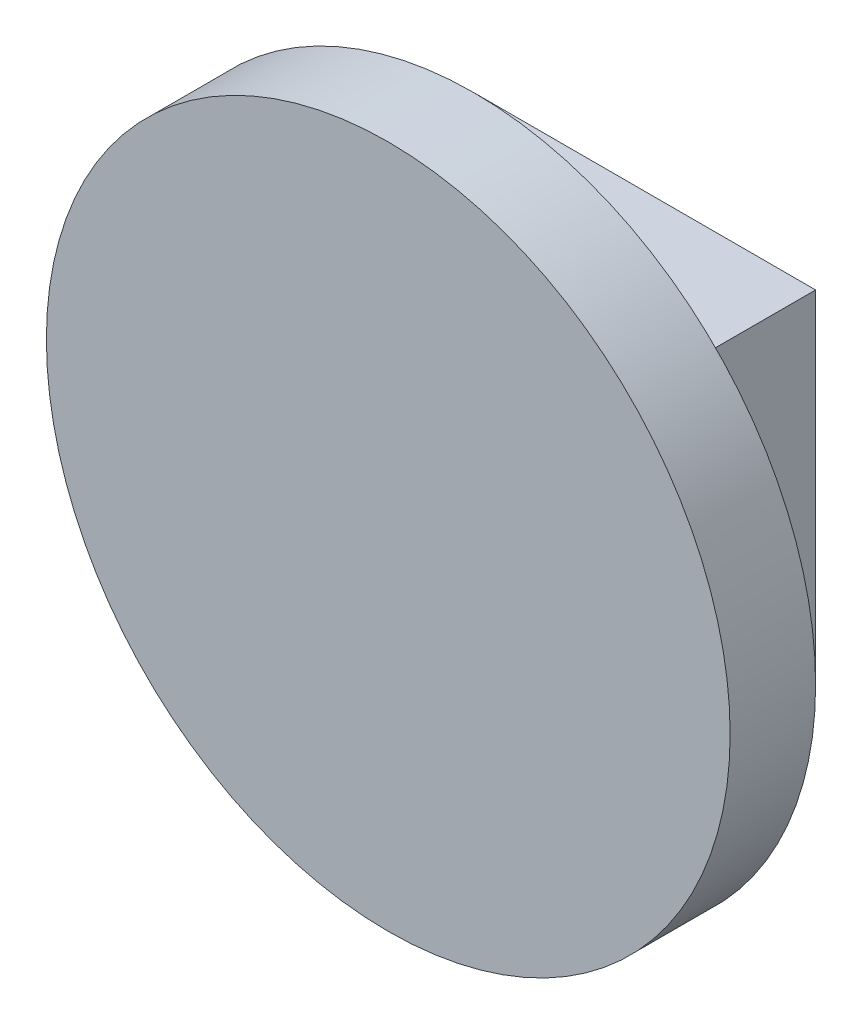
ISO-10303-21;
HEADER;
FILE_DESCRIPTION(('STEP AP214'),'2;1');
FILE_NAME('part.step','',(''),(''),'','','');
FILE_SCHEMA(('AUTOMOTIVE_DESIGN { 1 0 10303 214 1 1 1 1 }'));
ENDSEC;
DATA;
#1=APPLICATION_CONTEXT('core data for automotive mechanical design processes');
#2=APPLICATION_PROTOCOL_DEFINITION('international standard','automotive_design',2000,#1);
#3=PRODUCT_CONTEXT('',#1,'mechanical');
#4=PRODUCT('Part','Part','',(#3));
#5=PRODUCT_RELATED_PRODUCT_CATEGORY('part','',(#4));
#6=PRODUCT_DEFINITION_FORMATION('','',#4);
#7=PRODUCT_DEFINITION_CONTEXT('part definition',#1,'design');
#8=PRODUCT_DEFINITION('design','',#6,#7);
#9=PRODUCT_DEFINITION_SHAPE('','',#8);
#10=(LENGTH_UNIT() NAMED_UNIT(*) SI_UNIT(.MILLI.,.METRE.));
#11=(NAMED_UNIT(*) PLANE_ANGLE_UNIT() SI_UNIT($,.RADIAN.));
#12=(NAMED_UNIT(*) SI_UNIT($,.STERADIAN.) SOLID_ANGLE_UNIT());
#13=UNCERTAINTY_MEASURE_WITH_UNIT(LENGTH_MEASURE(1.E-05),#10,'distance_accuracy_value','');
#14=(GEOMETRIC_REPRESENTATION_CONTEXT(3) GLOBAL_UNCERTAINTY_ASSIGNED_CONTEXT((#13)) GLOBAL_UNIT_ASSIGNED_CONTEXT((#10,
#11,#12)) REPRESENTATION_CONTEXT('',''));
#15=CARTESIAN_POINT('',(0.,0.,0.));
#16=DIRECTION('',(0.,0.,1.));
#17=DIRECTION('',(1.,0.,0.));
#18=AXIS2_PLACEMENT_3D('',#15,#16,#17);
#19=CARTESIAN_POINT('',(0.,0.,0.));
#20=DIRECTION('',(0.,0.,1.));
#21=DIRECTION('',(1.,0.,0.));
#22=AXIS2_PLACEMENT_3D('',#19,#20,#21);
#23=PLANE('',#22);
#24=CARTESIAN_POINT('',(0.,0.,0.));
#25=DIRECTION('',(0.,0.,1.));
#26=DIRECTION('',(1.,0.,0.));
#27=AXIS2_PLACEMENT_3D('',#24,#25,#26);
#28=CIRCLE('',#27,6.35);
#29=CARTESIAN_POINT('',(6.35,0.,0.));
#30=VERTEX_POINT('',#29);
#31=EDGE_CURVE('E39',#30,#30,#28,.T.);
#32=ORIENTED_EDGE('',*,*,#31,.F.);
#33=EDGE_LOOP('',(#32));
#34=FACE_BOUND('',#33,.T.);
#35=DIRECTION('',(0.,1.,0.));
#36=VECTOR('',#35,1.);
#37=CARTESIAN_POINT('',(-3.175,-3.175,0.));
#38=LINE('',#37,#36);
#39=CARTESIAN_POINT('',(-3.175,-3.175,0.));
#40=VERTEX_POINT('',#39);
#41=CARTESIAN_POINT('',(-3.175,3.175,0.));
#42=VERTEX_POINT('',#41);
#43=EDGE_CURVE('E117',#40,#42,#38,.T.);
#44=ORIENTED_EDGE('',*,*,#43,.F.);
#45=DIRECTION('',(-1.,0.,0.));
#46=VECTOR('',#45,1.);
#47=CARTESIAN_POINT('',(3.175,-3.175,0.));
#48=LINE('',#47,#46);
#49=CARTESIAN_POINT('',(3.175,-3.175,0.));
#50=VERTEX_POINT('',#49);
#51=EDGE_CURVE('E145',#50,#40,#48,.T.);
#52=ORIENTED_EDGE('',*,*,#51,.F.);
#53=DIRECTION('',(0.,-1.,0.));
#54=VECTOR('',#53,1.);
#55=CARTESIAN_POINT('',(3.175,-3.175,0.));
#56=LINE('',#55,#54);
#57=CARTESIAN_POINT('',(3.175,3.175,0.));
#58=VERTEX_POINT('',#57);
#59=EDGE_CURVE('E55',#58,#50,#56,.T.);
#60=ORIENTED_EDGE('',*,*,#59,.F.);
#61=DIRECTION('',(1.,0.,0.));
#62=VECTOR('',#61,1.);
#63=CARTESIAN_POINT('',(3.175,3.175,0.));
#64=LINE('',#63,#62);
#65=EDGE_CURVE('E50',#42,#58,#64,.T.);
#66=ORIENTED_EDGE('',*,*,#65,.F.);
#67=EDGE_LOOP('',(#44,#52,#60,#66));
#68=FACE_BOUND('',#67,.T.);
#69=ADVANCED_FACE('F35',(#34,#68),#23,.F.);
#70=CARTESIAN_POINT('',(0.,0.,1.5875));
#71=DIRECTION('',(0.,0.,-1.));
#72=DIRECTION('',(-1.,0.,0.));
#73=AXIS2_PLACEMENT_3D('',#70,#71,#72);
#74=CYLINDRICAL_SURFACE('',#73,6.35);
#75=CARTESIAN_POINT('',(0.,0.,1.5875));
#76=DIRECTION('',(0.,0.,1.));
#77=DIRECTION('',(1.,0.,0.));
#78=AXIS2_PLACEMENT_3D('',#75,#76,#77);
#79=CIRCLE('',#78,6.35);
#80=CARTESIAN_POINT('',(6.35,0.,1.5875));
#81=VERTEX_POINT('',#80);
#82=EDGE_CURVE('E11',#81,#81,#79,.T.);
#83=ORIENTED_EDGE('',*,*,#82,.F.);
#84=EDGE_LOOP('',(#83));
#85=FACE_BOUND('',#84,.T.);
#86=ORIENTED_EDGE('',*,*,#31,.T.);
#87=EDGE_LOOP('',(#86));
#88=FACE_BOUND('',#87,.T.);
#89=ADVANCED_FACE('F37',(#85,#88),#74,.T.);
#90=CARTESIAN_POINT('',(0.,0.,1.5875));
#91=DIRECTION('',(0.,0.,1.));
#92=DIRECTION('',(1.,0.,0.));
#93=AXIS2_PLACEMENT_3D('',#90,#91,#92);
#94=PLANE('',#93);
#95=ORIENTED_EDGE('',*,*,#82,.T.);
#96=EDGE_LOOP('',(#95));
#97=FACE_BOUND('',#96,.T.);
#98=ADVANCED_FACE('F199',(#97),#94,.T.);
#99=CARTESIAN_POINT('',(0.,0.,-3.175));
#100=DIRECTION('',(0.,0.,1.));
#101=DIRECTION('',(1.,0.,0.));
#102=AXIS2_PLACEMENT_3D('',#99,#100,#101);
#103=PLANE('',#102);
#104=DIRECTION('',(0.,1.,0.));
#105=VECTOR('',#104,1.);
#106=CARTESIAN_POINT('',(-3.175,-3.175,-3.175));
#107=LINE('',#106,#105);
#108=CARTESIAN_POINT('',(-3.175,-3.175,-3.175));
#109=VERTEX_POINT('',#108);
#110=CARTESIAN_POINT('',(-3.175,3.175,-3.175));
#111=VERTEX_POINT('',#110);
#112=EDGE_CURVE('E141',#109,#111,#107,.T.);
#113=ORIENTED_EDGE('',*,*,#112,.T.);
#114=DIRECTION('',(1.,0.,0.));
#115=VECTOR('',#114,1.);
#116=CARTESIAN_POINT('',(3.175,3.175,-3.175));
#117=LINE('',#116,#115);
#118=CARTESIAN_POINT('',(3.175,3.175,-3.175));
#119=VERTEX_POINT('',#118);
#120=EDGE_CURVE('E144',#111,#119,#117,.T.);
#121=ORIENTED_EDGE('',*,*,#120,.T.);
#122=DIRECTION('',(0.,-1.,0.));
#123=VECTOR('',#122,1.);
#124=CARTESIAN_POINT('',(3.175,-3.175,-3.175));
#125=LINE('',#124,#123);
#126=CARTESIAN_POINT('',(3.175,-3.175,-3.175));
#127=VERTEX_POINT('',#126);
#128=EDGE_CURVE('E147',#119,#127,#125,.T.);
#129=ORIENTED_EDGE('',*,*,#128,.T.);
#130=DIRECTION('',(-1.,0.,0.));
#131=VECTOR('',#130,1.);
#132=CARTESIAN_POINT('',(3.175,-3.175,-3.175));
#133=LINE('',#132,#131);
#134=EDGE_CURVE('E149',#127,#109,#133,.T.);
#135=ORIENTED_EDGE('',*,*,#134,.T.);
#136=EDGE_LOOP('',(#113,#121,#129,#135));
#137=FACE_BOUND('',#136,.T.);
#138=DIRECTION('',(0.,1.,0.));
#139=VECTOR('',#138,1.);
#140=CARTESIAN_POINT('',(-1.5875,-1.5875,-3.175));
#141=LINE('',#140,#139);
#142=CARTESIAN_POINT('',(-1.5875,-1.5875,-3.175));
#143=VERTEX_POINT('',#142);
#144=CARTESIAN_POINT('',(-1.5875,1.5875,-3.175));
#145=VERTEX_POINT('',#144);
#146=EDGE_CURVE('E99',#143,#145,#141,.T.);
#147=ORIENTED_EDGE('',*,*,#146,.F.);
#148=DIRECTION('',(-1.,0.,0.));
#149=VECTOR('',#148,1.);
#150=CARTESIAN_POINT('',(1.5875,-1.5875,-3.175));
#151=LINE('',#150,#149);
#152=CARTESIAN_POINT('',(1.5875,-1.5875,-3.175));
#153=VERTEX_POINT('',#152);
#154=EDGE_CURVE('E125',#153,#143,#151,.T.);
#155=ORIENTED_EDGE('',*,*,#154,.F.);
#156=DIRECTION('',(0.,-1.,0.));
#157=VECTOR('',#156,1.);
#158=CARTESIAN_POINT('',(1.5875,-1.5875,-3.175));
#159=LINE('',#158,#157);
#160=CARTESIAN_POINT('',(1.5875,1.5875,-3.175));
#161=VERTEX_POINT('',#160);
#162=EDGE_CURVE('E123',#161,#153,#159,.T.);
#163=ORIENTED_EDGE('',*,*,#162,.F.);
#164=DIRECTION('',(1.,0.,0.));
#165=VECTOR('',#164,1.);
#166=CARTESIAN_POINT('',(1.5875,1.5875,-3.175));
#167=LINE('',#166,#165);
#168=EDGE_CURVE('E109',#145,#161,#167,.T.);
#169=ORIENTED_EDGE('',*,*,#168,.F.);
#170=EDGE_LOOP('',(#147,#155,#163,#169));
#171=FACE_BOUND('',#170,.T.);
#172=ADVANCED_FACE('F121',(#137,#171),#103,.F.);
#173=CARTESIAN_POINT('',(-3.175,-3.175,-3.175));
#174=DIRECTION('',(1.,0.,0.));
#175=DIRECTION('',(0.,0.,-1.));
#176=AXIS2_PLACEMENT_3D('',#173,#174,#175);
#177=PLANE('',#176);
#178=ORIENTED_EDGE('',*,*,#43,.T.);
#179=DIRECTION('',(0.,0.,1.));
#180=VECTOR('',#179,1.);
#181=CARTESIAN_POINT('',(-3.175,3.175,-3.175));
#182=LINE('',#181,#180);
#183=EDGE_CURVE('E166',#111,#42,#182,.T.);
#184=ORIENTED_EDGE('',*,*,#183,.F.);
#185=ORIENTED_EDGE('',*,*,#112,.F.);
#186=DIRECTION('',(0.,0.,1.));
#187=VECTOR('',#186,1.);
#188=CARTESIAN_POINT('',(-3.175,-3.175,-3.175));
#189=LINE('',#188,#187);
#190=EDGE_CURVE('E151',#109,#40,#189,.T.);
#191=ORIENTED_EDGE('',*,*,#190,.T.);
#192=EDGE_LOOP('',(#178,#184,#185,#191));
#193=FACE_BOUND('',#192,.T.);
#194=ADVANCED_FACE('F182',(#193),#177,.F.);
#195=CARTESIAN_POINT('',(3.175,3.175,-3.175));
#196=DIRECTION('',(0.,-1.,0.));
#197=DIRECTION('',(0.,0.,-1.));
#198=AXIS2_PLACEMENT_3D('',#195,#196,#197);
#199=PLANE('',#198);
#200=ORIENTED_EDGE('',*,*,#65,.T.);
#201=DIRECTION('',(0.,0.,1.));
#202=VECTOR('',#201,1.);
#203=CARTESIAN_POINT('',(3.175,3.175,-3.175));
#204=LINE('',#203,#202);
#205=EDGE_CURVE('E163',#119,#58,#204,.T.);
#206=ORIENTED_EDGE('',*,*,#205,.F.);
#207=ORIENTED_EDGE('',*,*,#120,.F.);
#208=ORIENTED_EDGE('',*,*,#183,.T.);
#209=EDGE_LOOP('',(#200,#206,#207,#208));
#210=FACE_BOUND('',#209,.T.);
#211=ADVANCED_FACE('F188',(#210),#199,.F.);
#212=CARTESIAN_POINT('',(3.175,-3.175,-3.175));
#213=DIRECTION('',(-1.,0.,0.));
#214=DIRECTION('',(0.,0.,1.));
#215=AXIS2_PLACEMENT_3D('',#212,#213,#214);
#216=PLANE('',#215);
#217=ORIENTED_EDGE('',*,*,#59,.T.);
#218=DIRECTION('',(0.,0.,1.));
#219=VECTOR('',#218,1.);
#220=CARTESIAN_POINT('',(3.175,-3.175,-3.175));
#221=LINE('',#220,#219);
#222=EDGE_CURVE('E160',#127,#50,#221,.T.);
#223=ORIENTED_EDGE('',*,*,#222,.F.);
#224=ORIENTED_EDGE('',*,*,#128,.F.);
#225=ORIENTED_EDGE('',*,*,#205,.T.);
#226=EDGE_LOOP('',(#217,#223,#224,#225));
#227=FACE_BOUND('',#226,.T.);
#228=ADVANCED_FACE('F187',(#227),#216,.F.);
#229=CARTESIAN_POINT('',(3.175,-3.175,-3.175));
#230=DIRECTION('',(0.,1.,0.));
#231=DIRECTION('',(0.,0.,1.));
#232=AXIS2_PLACEMENT_3D('',#229,#230,#231);
#233=PLANE('',#232);
#234=ORIENTED_EDGE('',*,*,#51,.T.);
#235=ORIENTED_EDGE('',*,*,#190,.F.);
#236=ORIENTED_EDGE('',*,*,#134,.F.);
#237=ORIENTED_EDGE('',*,*,#222,.T.);
#238=EDGE_LOOP('',(#234,#235,#236,#237));
#239=FACE_BOUND('',#238,.T.);
#240=ADVANCED_FACE('F178',(#239),#233,.F.);
#241=CARTESIAN_POINT('',(-1.5875,-1.5875,-3.175));
#242=DIRECTION('',(1.,0.,0.));
#243=DIRECTION('',(0.,0.,-1.));
#244=AXIS2_PLACEMENT_3D('',#241,#242,#243);
#245=PLANE('',#244);
#246=DIRECTION('',(0.,1.,0.));
#247=VECTOR('',#246,1.);
#248=CARTESIAN_POINT('',(-1.5875,-1.5875,0.));
#249=LINE('',#248,#247);
#250=CARTESIAN_POINT('',(-1.5875,-1.5875,0.));
#251=VERTEX_POINT('',#250);
#252=CARTESIAN_POINT('',(-1.5875,1.5875,0.));
#253=VERTEX_POINT('',#252);
#254=EDGE_CURVE('E129',#251,#253,#249,.T.);
#255=ORIENTED_EDGE('',*,*,#254,.F.);
#256=DIRECTION('',(0.,0.,1.));
#257=VECTOR('',#256,1.);
#258=CARTESIAN_POINT('',(-1.5875,-1.5875,-3.175));
#259=LINE('',#258,#257);
#260=EDGE_CURVE('E105',#143,#251,#259,.T.);
#261=ORIENTED_EDGE('',*,*,#260,.F.);
#262=ORIENTED_EDGE('',*,*,#146,.T.);
#263=DIRECTION('',(0.,0.,1.));
#264=VECTOR('',#263,1.);
#265=CARTESIAN_POINT('',(-1.5875,1.5875,-3.175));
#266=LINE('',#265,#264);
#267=EDGE_CURVE('E103',#145,#253,#266,.T.);
#268=ORIENTED_EDGE('',*,*,#267,.T.);
#269=EDGE_LOOP('',(#255,#261,#262,#268));
#270=FACE_BOUND('',#269,.T.);
#271=ADVANCED_FACE('F102',(#270),#245,.T.);
#272=CARTESIAN_POINT('',(1.5875,1.5875,-3.175));
#273=DIRECTION('',(0.,-1.,0.));
#274=DIRECTION('',(0.,0.,-1.));
#275=AXIS2_PLACEMENT_3D('',#272,#273,#274);
#276=PLANE('',#275);
#277=DIRECTION('',(1.,0.,0.));
#278=VECTOR('',#277,1.);
#279=CARTESIAN_POINT('',(1.5875,1.5875,0.));
#280=LINE('',#279,#278);
#281=CARTESIAN_POINT('',(1.5875,1.5875,0.));
#282=VERTEX_POINT('',#281);
#283=EDGE_CURVE('E116',#253,#282,#280,.T.);
#284=ORIENTED_EDGE('',*,*,#283,.F.);
#285=ORIENTED_EDGE('',*,*,#267,.F.);
#286=ORIENTED_EDGE('',*,*,#168,.T.);
#287=DIRECTION('',(0.,0.,1.));
#288=VECTOR('',#287,1.);
#289=CARTESIAN_POINT('',(1.5875,1.5875,-3.175));
#290=LINE('',#289,#288);
#291=EDGE_CURVE('E118',#161,#282,#290,.T.);
#292=ORIENTED_EDGE('',*,*,#291,.T.);
#293=EDGE_LOOP('',(#284,#285,#286,#292));
#294=FACE_BOUND('',#293,.T.);
#295=ADVANCED_FACE('F113',(#294),#276,.T.);
#296=CARTESIAN_POINT('',(1.5875,-1.5875,-3.175));
#297=DIRECTION('',(-1.,0.,0.));
#298=DIRECTION('',(0.,0.,1.));
#299=AXIS2_PLACEMENT_3D('',#296,#297,#298);
#300=PLANE('',#299);
#301=DIRECTION('',(0.,-1.,0.));
#302=VECTOR('',#301,1.);
#303=CARTESIAN_POINT('',(1.5875,-1.5875,0.));
#304=LINE('',#303,#302);
#305=CARTESIAN_POINT('',(1.5875,-1.5875,0.));
#306=VERTEX_POINT('',#305);
#307=EDGE_CURVE('E132',#282,#306,#304,.T.);
#308=ORIENTED_EDGE('',*,*,#307,.F.);
#309=ORIENTED_EDGE('',*,*,#291,.F.);
#310=ORIENTED_EDGE('',*,*,#162,.T.);
#311=DIRECTION('',(0.,0.,1.));
#312=VECTOR('',#311,1.);
#313=CARTESIAN_POINT('',(1.5875,-1.5875,-3.175));
#314=LINE('',#313,#312);
#315=EDGE_CURVE('E138',#153,#306,#314,.T.);
#316=ORIENTED_EDGE('',*,*,#315,.T.);
#317=EDGE_LOOP('',(#308,#309,#310,#316));
#318=FACE_BOUND('',#317,.T.);
#319=ADVANCED_FACE('F208',(#318),#300,.T.);
#320=CARTESIAN_POINT('',(1.5875,-1.5875,-3.175));
#321=DIRECTION('',(0.,1.,0.));
#322=DIRECTION('',(0.,0.,1.));
#323=AXIS2_PLACEMENT_3D('',#320,#321,#322);
#324=PLANE('',#323);
#325=DIRECTION('',(-1.,0.,0.));
#326=VECTOR('',#325,1.);
#327=CARTESIAN_POINT('',(1.5875,-1.5875,0.));
#328=LINE('',#327,#326);
#329=EDGE_CURVE('E110',#306,#251,#328,.T.);
#330=ORIENTED_EDGE('',*,*,#329,.F.);
#331=ORIENTED_EDGE('',*,*,#315,.F.);
#332=ORIENTED_EDGE('',*,*,#154,.T.);
#333=ORIENTED_EDGE('',*,*,#260,.T.);
#334=EDGE_LOOP('',(#330,#331,#332,#333));
#335=FACE_BOUND('',#334,.T.);
#336=ADVANCED_FACE('F203',(#335),#324,.T.);
#337=ORIENTED_EDGE('',*,*,#329,.T.);
#338=ORIENTED_EDGE('',*,*,#254,.T.);
#339=ORIENTED_EDGE('',*,*,#283,.T.);
#340=ORIENTED_EDGE('',*,*,#307,.T.);
#341=EDGE_LOOP('',(#337,#338,#339,#340));
#342=FACE_BOUND('',#341,.T.);
#343=ADVANCED_FACE('F174',(#342),#23,.F.);
#344=CLOSED_SHELL('',(#69,#89,#98,#172,#194,#211,#228,#240,#271,#295,#319,#336,#343));
#345=MANIFOLD_SOLID_BREP('B2',#344);
#346=ADVANCED_BREP_SHAPE_REPRESENTATION('',(#18,#345),#14);
#347=SHAPE_DEFINITION_REPRESENTATION(#9,#346);
ENDSEC;
END-ISO-10303-21;
